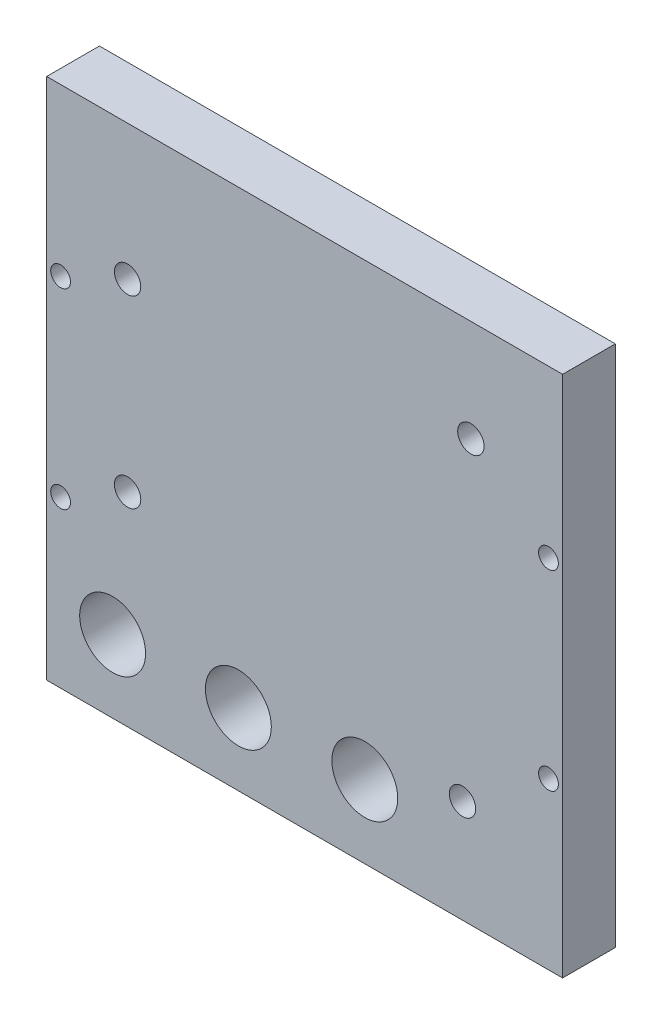
ISO-10303-21;
HEADER;
FILE_DESCRIPTION(('STEP AP214'),'2;1');
FILE_NAME('part.step','',(''),(''),'','','');
FILE_SCHEMA(('AUTOMOTIVE_DESIGN { 1 0 10303 214 1 1 1 1 }'));
ENDSEC;
DATA;
#1=APPLICATION_CONTEXT('core data for automotive mechanical design processes');
#2=APPLICATION_PROTOCOL_DEFINITION('international standard','automotive_design',2000,#1);
#3=PRODUCT_CONTEXT('',#1,'mechanical');
#4=PRODUCT('Part','Part','',(#3));
#5=PRODUCT_RELATED_PRODUCT_CATEGORY('part','',(#4));
#6=PRODUCT_DEFINITION_FORMATION('','',#4);
#7=PRODUCT_DEFINITION_CONTEXT('part definition',#1,'design');
#8=PRODUCT_DEFINITION('design','',#6,#7);
#9=PRODUCT_DEFINITION_SHAPE('','',#8);
#10=(LENGTH_UNIT() NAMED_UNIT(*) SI_UNIT(.MILLI.,.METRE.));
#11=(NAMED_UNIT(*) PLANE_ANGLE_UNIT() SI_UNIT($,.RADIAN.));
#12=(NAMED_UNIT(*) SI_UNIT($,.STERADIAN.) SOLID_ANGLE_UNIT());
#13=UNCERTAINTY_MEASURE_WITH_UNIT(LENGTH_MEASURE(1.E-05),#10,'distance_accuracy_value','');
#14=(GEOMETRIC_REPRESENTATION_CONTEXT(3) GLOBAL_UNCERTAINTY_ASSIGNED_CONTEXT((#13)) GLOBAL_UNIT_ASSIGNED_CONTEXT((#10,
#11,#12)) REPRESENTATION_CONTEXT('',''));
#15=CARTESIAN_POINT('',(0.,0.,0.));
#16=DIRECTION('',(0.,0.,1.));
#17=DIRECTION('',(1.,0.,0.));
#18=AXIS2_PLACEMENT_3D('',#15,#16,#17);
#19=CARTESIAN_POINT('',(0.,0.,8.));
#20=DIRECTION('',(0.,0.,-1.));
#21=DIRECTION('',(-1.,0.,0.));
#22=AXIS2_PLACEMENT_3D('',#19,#20,#21);
#23=PLANE('',#22);
#24=CARTESIAN_POINT('',(37.1622767978347,-14.1859211349172,8.));
#25=DIRECTION('',(0.,0.,1.));
#26=DIRECTION('',(1.,0.,0.));
#27=AXIS2_PLACEMENT_3D('',#24,#25,#26);
#28=CIRCLE('',#27,1.50000000000002);
#29=CARTESIAN_POINT('',(38.6622767978348,-14.1859211349172,8.));
#30=VERTEX_POINT('',#29);
#31=EDGE_CURVE('E163',#30,#30,#28,.T.);
#32=ORIENTED_EDGE('',*,*,#31,.F.);
#33=EDGE_LOOP('',(#32));
#34=FACE_BOUND('',#33,.T.);
#35=CARTESIAN_POINT('',(-36.8377232021654,14.8140788650827,8.));
#36=DIRECTION('',(0.,0.,1.));
#37=DIRECTION('',(1.,0.,0.));
#38=AXIS2_PLACEMENT_3D('',#35,#36,#37);
#39=CIRCLE('',#38,1.49999999999997);
#40=CARTESIAN_POINT('',(-35.3377232021654,14.8140788650827,8.));
#41=VERTEX_POINT('',#40);
#42=EDGE_CURVE('E151',#41,#41,#39,.T.);
#43=ORIENTED_EDGE('',*,*,#42,.F.);
#44=EDGE_LOOP('',(#43));
#45=FACE_BOUND('',#44,.T.);
#46=CARTESIAN_POINT('',(24.1226954878032,-23.6777548777828,8.));
#47=DIRECTION('',(0.,0.,1.));
#48=DIRECTION('',(1.,0.,0.));
#49=AXIS2_PLACEMENT_3D('',#46,#47,#48);
#50=CIRCLE('',#49,2.);
#51=CARTESIAN_POINT('',(26.1226954878032,-23.6777548777828,8.));
#52=VERTEX_POINT('',#51);
#53=EDGE_CURVE('E139',#52,#52,#50,.T.);
#54=ORIENTED_EDGE('',*,*,#53,.F.);
#55=EDGE_LOOP('',(#54));
#56=FACE_BOUND('',#55,.T.);
#57=CARTESIAN_POINT('',(-26.677304512197,19.502245122217,8.));
#58=DIRECTION('',(0.,0.,1.));
#59=DIRECTION('',(1.,0.,0.));
#60=AXIS2_PLACEMENT_3D('',#57,#58,#59);
#61=CIRCLE('',#60,2.);
#62=CARTESIAN_POINT('',(-24.677304512197,19.502245122217,8.));
#63=VERTEX_POINT('',#62);
#64=EDGE_CURVE('E127',#63,#63,#61,.T.);
#65=ORIENTED_EDGE('',*,*,#64,.F.);
#66=EDGE_LOOP('',(#65));
#67=FACE_BOUND('',#66,.T.);
#68=CARTESIAN_POINT('',(9.30112256110283,-28.2174246694478,8.));
#69=DIRECTION('',(0.,0.,1.));
#70=DIRECTION('',(1.,0.,0.));
#71=AXIS2_PLACEMENT_3D('',#68,#69,#70);
#72=CIRCLE('',#71,4.99999999999999);
#73=CARTESIAN_POINT('',(14.3011225611028,-28.2174246694478,8.));
#74=VERTEX_POINT('',#73);
#75=EDGE_CURVE('E115',#74,#74,#72,.T.);
#76=ORIENTED_EDGE('',*,*,#75,.F.);
#77=EDGE_LOOP('',(#76));
#78=FACE_BOUND('',#77,.T.);
#79=DIRECTION('',(1.,0.,0.));
#80=VECTOR('',#79,1.);
#81=CARTESIAN_POINT('',(-38.9488774388858,-39.2977548777828,8.));
#82=LINE('',#81,#80);
#83=CARTESIAN_POINT('',(-38.9488774388858,-39.2977548777828,8.));
#84=VERTEX_POINT('',#83);
#85=CARTESIAN_POINT('',(39.3011225611029,-39.2977548777828,8.));
#86=VERTEX_POINT('',#85);
#87=EDGE_CURVE('E85',#84,#86,#82,.T.);
#88=ORIENTED_EDGE('',*,*,#87,.T.);
#89=DIRECTION('',(0.,1.,0.));
#90=VECTOR('',#89,1.);
#91=CARTESIAN_POINT('',(39.3011225611029,40.0022451222172,8.));
#92=LINE('',#91,#90);
#93=CARTESIAN_POINT('',(39.3011225611029,40.0022451222172,8.));
#94=VERTEX_POINT('',#93);
#95=EDGE_CURVE('E80',#86,#94,#92,.T.);
#96=ORIENTED_EDGE('',*,*,#95,.T.);
#97=DIRECTION('',(-1.,0.,0.));
#98=VECTOR('',#97,1.);
#99=CARTESIAN_POINT('',(-38.9488774388858,40.0022451222172,8.));
#100=LINE('',#99,#98);
#101=CARTESIAN_POINT('',(-38.9488774388858,40.0022451222172,8.));
#102=VERTEX_POINT('',#101);
#103=EDGE_CURVE('E83',#94,#102,#100,.T.);
#104=ORIENTED_EDGE('',*,*,#103,.T.);
#105=DIRECTION('',(0.,-1.,0.));
#106=VECTOR('',#105,1.);
#107=CARTESIAN_POINT('',(-38.9488774388858,40.0022451222172,8.));
#108=LINE('',#107,#106);
#109=EDGE_CURVE('E50',#102,#84,#108,.T.);
#110=ORIENTED_EDGE('',*,*,#109,.T.);
#111=EDGE_LOOP('',(#88,#96,#104,#110));
#112=FACE_BOUND('',#111,.T.);
#113=CARTESIAN_POINT('',(-9.87519483882215,-28.3944124302774,8.));
#114=DIRECTION('',(0.,0.,1.));
#115=DIRECTION('',(1.,0.,0.));
#116=AXIS2_PLACEMENT_3D('',#113,#114,#115);
#117=CIRCLE('',#116,4.99999999999999);
#118=CARTESIAN_POINT('',(-4.87519483882216,-28.3944124302774,8.));
#119=VERTEX_POINT('',#118);
#120=EDGE_CURVE('E100',#119,#119,#117,.T.);
#121=ORIENTED_EDGE('',*,*,#120,.F.);
#122=EDGE_LOOP('',(#121));
#123=FACE_BOUND('',#122,.T.);
#124=CARTESIAN_POINT('',(-28.9488774388857,-28.3036465583011,8.));
#125=DIRECTION('',(0.,0.,1.));
#126=DIRECTION('',(-1.,0.,0.));
#127=AXIS2_PLACEMENT_3D('',#124,#125,#126);
#128=CIRCLE('',#127,4.99999999999999);
#129=CARTESIAN_POINT('',(-33.9488774388857,-28.3036465583011,8.));
#130=VERTEX_POINT('',#129);
#131=EDGE_CURVE('E121',#130,#130,#128,.T.);
#132=ORIENTED_EDGE('',*,*,#131,.F.);
#133=EDGE_LOOP('',(#132));
#134=FACE_BOUND('',#133,.T.);
#135=CARTESIAN_POINT('',(-26.677304512197,-8.43775487778289,8.));
#136=DIRECTION('',(0.,0.,1.));
#137=DIRECTION('',(1.,0.,0.));
#138=AXIS2_PLACEMENT_3D('',#135,#136,#137);
#139=CIRCLE('',#138,2.0000000000001);
#140=CARTESIAN_POINT('',(-24.6773045121969,-8.43775487778289,8.));
#141=VERTEX_POINT('',#140);
#142=EDGE_CURVE('E133',#141,#141,#139,.T.);
#143=ORIENTED_EDGE('',*,*,#142,.F.);
#144=EDGE_LOOP('',(#143));
#145=FACE_BOUND('',#144,.T.);
#146=CARTESIAN_POINT('',(25.392695487803,24.5822451222173,8.));
#147=DIRECTION('',(0.,0.,1.));
#148=DIRECTION('',(1.,0.,0.));
#149=AXIS2_PLACEMENT_3D('',#146,#147,#148);
#150=CIRCLE('',#149,2.);
#151=CARTESIAN_POINT('',(27.392695487803,24.5822451222173,8.));
#152=VERTEX_POINT('',#151);
#153=EDGE_CURVE('E145',#152,#152,#150,.T.);
#154=ORIENTED_EDGE('',*,*,#153,.F.);
#155=EDGE_LOOP('',(#154));
#156=FACE_BOUND('',#155,.T.);
#157=CARTESIAN_POINT('',(-36.8377232021653,-14.1859211349174,8.));
#158=DIRECTION('',(0.,0.,1.));
#159=DIRECTION('',(1.,0.,0.));
#160=AXIS2_PLACEMENT_3D('',#157,#158,#159);
#161=CIRCLE('',#160,1.49999999999997);
#162=CARTESIAN_POINT('',(-35.3377232021653,-14.1859211349174,8.));
#163=VERTEX_POINT('',#162);
#164=EDGE_CURVE('E157',#163,#163,#161,.T.);
#165=ORIENTED_EDGE('',*,*,#164,.F.);
#166=EDGE_LOOP('',(#165));
#167=FACE_BOUND('',#166,.T.);
#168=CARTESIAN_POINT('',(37.1622767978346,14.8140788650829,8.));
#169=DIRECTION('',(0.,0.,1.));
#170=DIRECTION('',(1.,0.,0.));
#171=AXIS2_PLACEMENT_3D('',#168,#169,#170);
#172=CIRCLE('',#171,1.49999999999997);
#173=CARTESIAN_POINT('',(38.6622767978346,14.8140788650829,8.));
#174=VERTEX_POINT('',#173);
#175=EDGE_CURVE('E169',#174,#174,#172,.T.);
#176=ORIENTED_EDGE('',*,*,#175,.F.);
#177=EDGE_LOOP('',(#176));
#178=FACE_BOUND('',#177,.T.);
#179=ADVANCED_FACE('F33',(#34,#45,#56,#67,#78,#112,#123,#134,#145,#156,#167,#178),#23,.F.);
#180=CARTESIAN_POINT('',(0.,0.,0.));
#181=DIRECTION('',(0.,0.,-1.));
#182=DIRECTION('',(-1.,0.,0.));
#183=AXIS2_PLACEMENT_3D('',#180,#181,#182);
#184=PLANE('',#183);
#185=CARTESIAN_POINT('',(37.1622767978347,-14.1859211349172,0.));
#186=DIRECTION('',(0.,0.,1.));
#187=DIRECTION('',(1.,0.,0.));
#188=AXIS2_PLACEMENT_3D('',#185,#186,#187);
#189=CIRCLE('',#188,1.50000000000002);
#190=CARTESIAN_POINT('',(38.6622767978348,-14.1859211349172,0.));
#191=VERTEX_POINT('',#190);
#192=EDGE_CURVE('E166',#191,#191,#189,.T.);
#193=ORIENTED_EDGE('',*,*,#192,.T.);
#194=EDGE_LOOP('',(#193));
#195=FACE_BOUND('',#194,.T.);
#196=CARTESIAN_POINT('',(-36.8377232021654,14.8140788650827,0.));
#197=DIRECTION('',(0.,0.,1.));
#198=DIRECTION('',(1.,0.,0.));
#199=AXIS2_PLACEMENT_3D('',#196,#197,#198);
#200=CIRCLE('',#199,1.49999999999997);
#201=CARTESIAN_POINT('',(-35.3377232021654,14.8140788650827,0.));
#202=VERTEX_POINT('',#201);
#203=EDGE_CURVE('E154',#202,#202,#200,.T.);
#204=ORIENTED_EDGE('',*,*,#203,.T.);
#205=EDGE_LOOP('',(#204));
#206=FACE_BOUND('',#205,.T.);
#207=CARTESIAN_POINT('',(24.1226954878032,-23.6777548777828,0.));
#208=DIRECTION('',(0.,0.,1.));
#209=DIRECTION('',(1.,0.,0.));
#210=AXIS2_PLACEMENT_3D('',#207,#208,#209);
#211=CIRCLE('',#210,2.);
#212=CARTESIAN_POINT('',(26.1226954878032,-23.6777548777828,0.));
#213=VERTEX_POINT('',#212);
#214=EDGE_CURVE('E142',#213,#213,#211,.T.);
#215=ORIENTED_EDGE('',*,*,#214,.T.);
#216=EDGE_LOOP('',(#215));
#217=FACE_BOUND('',#216,.T.);
#218=CARTESIAN_POINT('',(-26.677304512197,19.502245122217,0.));
#219=DIRECTION('',(0.,0.,1.));
#220=DIRECTION('',(1.,0.,0.));
#221=AXIS2_PLACEMENT_3D('',#218,#219,#220);
#222=CIRCLE('',#221,2.);
#223=CARTESIAN_POINT('',(-24.677304512197,19.502245122217,0.));
#224=VERTEX_POINT('',#223);
#225=EDGE_CURVE('E130',#224,#224,#222,.T.);
#226=ORIENTED_EDGE('',*,*,#225,.T.);
#227=EDGE_LOOP('',(#226));
#228=FACE_BOUND('',#227,.T.);
#229=CARTESIAN_POINT('',(9.30112256110283,-28.2174246694478,0.));
#230=DIRECTION('',(0.,0.,1.));
#231=DIRECTION('',(1.,0.,0.));
#232=AXIS2_PLACEMENT_3D('',#229,#230,#231);
#233=CIRCLE('',#232,4.99999999999999);
#234=CARTESIAN_POINT('',(14.3011225611028,-28.2174246694478,0.));
#235=VERTEX_POINT('',#234);
#236=EDGE_CURVE('E118',#235,#235,#233,.T.);
#237=ORIENTED_EDGE('',*,*,#236,.T.);
#238=EDGE_LOOP('',(#237));
#239=FACE_BOUND('',#238,.T.);
#240=DIRECTION('',(1.,0.,0.));
#241=VECTOR('',#240,1.);
#242=CARTESIAN_POINT('',(-38.9488774388858,-39.2977548777828,0.));
#243=LINE('',#242,#241);
#244=CARTESIAN_POINT('',(-38.9488774388858,-39.2977548777828,0.));
#245=VERTEX_POINT('',#244);
#246=CARTESIAN_POINT('',(39.3011225611029,-39.2977548777828,0.));
#247=VERTEX_POINT('',#246);
#248=EDGE_CURVE('E97',#245,#247,#243,.T.);
#249=ORIENTED_EDGE('',*,*,#248,.F.);
#250=DIRECTION('',(0.,-1.,0.));
#251=VECTOR('',#250,1.);
#252=CARTESIAN_POINT('',(-38.9488774388858,40.0022451222172,0.));
#253=LINE('',#252,#251);
#254=CARTESIAN_POINT('',(-38.9488774388858,40.0022451222172,0.));
#255=VERTEX_POINT('',#254);
#256=EDGE_CURVE('E73',#255,#245,#253,.T.);
#257=ORIENTED_EDGE('',*,*,#256,.F.);
#258=DIRECTION('',(-1.,0.,0.));
#259=VECTOR('',#258,1.);
#260=CARTESIAN_POINT('',(-38.9488774388858,40.0022451222172,0.));
#261=LINE('',#260,#259);
#262=CARTESIAN_POINT('',(39.3011225611029,40.0022451222172,0.));
#263=VERTEX_POINT('',#262);
#264=EDGE_CURVE('E67',#263,#255,#261,.T.);
#265=ORIENTED_EDGE('',*,*,#264,.F.);
#266=DIRECTION('',(0.,1.,0.));
#267=VECTOR('',#266,1.);
#268=CARTESIAN_POINT('',(39.3011225611029,40.0022451222172,0.));
#269=LINE('',#268,#267);
#270=EDGE_CURVE('E89',#247,#263,#269,.T.);
#271=ORIENTED_EDGE('',*,*,#270,.F.);
#272=EDGE_LOOP('',(#249,#257,#265,#271));
#273=FACE_BOUND('',#272,.T.);
#274=CARTESIAN_POINT('',(-9.87519483882215,-28.3944124302774,0.));
#275=DIRECTION('',(0.,0.,1.));
#276=DIRECTION('',(1.,0.,0.));
#277=AXIS2_PLACEMENT_3D('',#274,#275,#276);
#278=CIRCLE('',#277,4.99999999999999);
#279=CARTESIAN_POINT('',(-4.87519483882216,-28.3944124302774,0.));
#280=VERTEX_POINT('',#279);
#281=EDGE_CURVE('E112',#280,#280,#278,.T.);
#282=ORIENTED_EDGE('',*,*,#281,.T.);
#283=EDGE_LOOP('',(#282));
#284=FACE_BOUND('',#283,.T.);
#285=CARTESIAN_POINT('',(-28.9488774388857,-28.3036465583011,0.));
#286=DIRECTION('',(0.,0.,1.));
#287=DIRECTION('',(-1.,0.,0.));
#288=AXIS2_PLACEMENT_3D('',#285,#286,#287);
#289=CIRCLE('',#288,4.99999999999999);
#290=CARTESIAN_POINT('',(-33.9488774388857,-28.3036465583011,0.));
#291=VERTEX_POINT('',#290);
#292=EDGE_CURVE('E124',#291,#291,#289,.T.);
#293=ORIENTED_EDGE('',*,*,#292,.T.);
#294=EDGE_LOOP('',(#293));
#295=FACE_BOUND('',#294,.T.);
#296=CARTESIAN_POINT('',(-26.677304512197,-8.43775487778289,0.));
#297=DIRECTION('',(0.,0.,1.));
#298=DIRECTION('',(1.,0.,0.));
#299=AXIS2_PLACEMENT_3D('',#296,#297,#298);
#300=CIRCLE('',#299,2.0000000000001);
#301=CARTESIAN_POINT('',(-24.6773045121969,-8.43775487778289,0.));
#302=VERTEX_POINT('',#301);
#303=EDGE_CURVE('E136',#302,#302,#300,.T.);
#304=ORIENTED_EDGE('',*,*,#303,.T.);
#305=EDGE_LOOP('',(#304));
#306=FACE_BOUND('',#305,.T.);
#307=CARTESIAN_POINT('',(25.392695487803,24.5822451222173,0.));
#308=DIRECTION('',(0.,0.,1.));
#309=DIRECTION('',(1.,0.,0.));
#310=AXIS2_PLACEMENT_3D('',#307,#308,#309);
#311=CIRCLE('',#310,2.);
#312=CARTESIAN_POINT('',(27.392695487803,24.5822451222173,0.));
#313=VERTEX_POINT('',#312);
#314=EDGE_CURVE('E148',#313,#313,#311,.T.);
#315=ORIENTED_EDGE('',*,*,#314,.T.);
#316=EDGE_LOOP('',(#315));
#317=FACE_BOUND('',#316,.T.);
#318=CARTESIAN_POINT('',(-36.8377232021653,-14.1859211349174,0.));
#319=DIRECTION('',(0.,0.,1.));
#320=DIRECTION('',(1.,0.,0.));
#321=AXIS2_PLACEMENT_3D('',#318,#319,#320);
#322=CIRCLE('',#321,1.49999999999997);
#323=CARTESIAN_POINT('',(-35.3377232021653,-14.1859211349174,0.));
#324=VERTEX_POINT('',#323);
#325=EDGE_CURVE('E160',#324,#324,#322,.T.);
#326=ORIENTED_EDGE('',*,*,#325,.T.);
#327=EDGE_LOOP('',(#326));
#328=FACE_BOUND('',#327,.T.);
#329=CARTESIAN_POINT('',(37.1622767978346,14.8140788650829,0.));
#330=DIRECTION('',(0.,0.,1.));
#331=DIRECTION('',(1.,0.,0.));
#332=AXIS2_PLACEMENT_3D('',#329,#330,#331);
#333=CIRCLE('',#332,1.49999999999997);
#334=CARTESIAN_POINT('',(38.6622767978346,14.8140788650829,0.));
#335=VERTEX_POINT('',#334);
#336=EDGE_CURVE('E172',#335,#335,#333,.T.);
#337=ORIENTED_EDGE('',*,*,#336,.T.);
#338=EDGE_LOOP('',(#337));
#339=FACE_BOUND('',#338,.T.);
#340=ADVANCED_FACE('F108',(#195,#206,#217,#228,#239,#273,#284,#295,#306,#317,#328,#339),#184,.T.);
#341=CARTESIAN_POINT('',(-38.9488774388858,-39.2977548777828,8.));
#342=DIRECTION('',(0.,1.,0.));
#343=DIRECTION('',(0.,0.,1.));
#344=AXIS2_PLACEMENT_3D('',#341,#342,#343);
#345=PLANE('',#344);
#346=ORIENTED_EDGE('',*,*,#248,.T.);
#347=DIRECTION('',(0.,0.,-1.));
#348=VECTOR('',#347,1.);
#349=CARTESIAN_POINT('',(39.3011225611029,-39.2977548777828,8.));
#350=LINE('',#349,#348);
#351=EDGE_CURVE('E11',#86,#247,#350,.T.);
#352=ORIENTED_EDGE('',*,*,#351,.F.);
#353=ORIENTED_EDGE('',*,*,#87,.F.);
#354=DIRECTION('',(0.,0.,-1.));
#355=VECTOR('',#354,1.);
#356=CARTESIAN_POINT('',(-38.9488774388858,-39.2977548777828,8.));
#357=LINE('',#356,#355);
#358=EDGE_CURVE('E93',#84,#245,#357,.T.);
#359=ORIENTED_EDGE('',*,*,#358,.T.);
#360=EDGE_LOOP('',(#346,#352,#353,#359));
#361=FACE_BOUND('',#360,.T.);
#362=ADVANCED_FACE('F35',(#361),#345,.F.);
#363=CARTESIAN_POINT('',(39.3011225611029,40.0022451222172,8.));
#364=DIRECTION('',(-1.,0.,0.));
#365=DIRECTION('',(0.,0.,1.));
#366=AXIS2_PLACEMENT_3D('',#363,#364,#365);
#367=PLANE('',#366);
#368=ORIENTED_EDGE('',*,*,#270,.T.);
#369=DIRECTION('',(0.,0.,-1.));
#370=VECTOR('',#369,1.);
#371=CARTESIAN_POINT('',(39.3011225611029,40.0022451222172,8.));
#372=LINE('',#371,#370);
#373=EDGE_CURVE('E42',#94,#263,#372,.T.);
#374=ORIENTED_EDGE('',*,*,#373,.F.);
#375=ORIENTED_EDGE('',*,*,#95,.F.);
#376=ORIENTED_EDGE('',*,*,#351,.T.);
#377=EDGE_LOOP('',(#368,#374,#375,#376));
#378=FACE_BOUND('',#377,.T.);
#379=ADVANCED_FACE('F88',(#378),#367,.F.);
#380=CARTESIAN_POINT('',(-38.9488774388858,40.0022451222172,8.));
#381=DIRECTION('',(0.,-1.,0.));
#382=DIRECTION('',(0.,0.,-1.));
#383=AXIS2_PLACEMENT_3D('',#380,#381,#382);
#384=PLANE('',#383);
#385=ORIENTED_EDGE('',*,*,#264,.T.);
#386=DIRECTION('',(0.,0.,-1.));
#387=VECTOR('',#386,1.);
#388=CARTESIAN_POINT('',(-38.9488774388858,40.0022451222172,8.));
#389=LINE('',#388,#387);
#390=EDGE_CURVE('E90',#102,#255,#389,.T.);
#391=ORIENTED_EDGE('',*,*,#390,.F.);
#392=ORIENTED_EDGE('',*,*,#103,.F.);
#393=ORIENTED_EDGE('',*,*,#373,.T.);
#394=EDGE_LOOP('',(#385,#391,#392,#393));
#395=FACE_BOUND('',#394,.T.);
#396=ADVANCED_FACE('F91',(#395),#384,.F.);
#397=CARTESIAN_POINT('',(-38.9488774388858,40.0022451222172,8.));
#398=DIRECTION('',(1.,0.,0.));
#399=DIRECTION('',(0.,0.,-1.));
#400=AXIS2_PLACEMENT_3D('',#397,#398,#399);
#401=PLANE('',#400);
#402=ORIENTED_EDGE('',*,*,#256,.T.);
#403=ORIENTED_EDGE('',*,*,#358,.F.);
#404=ORIENTED_EDGE('',*,*,#109,.F.);
#405=ORIENTED_EDGE('',*,*,#390,.T.);
#406=EDGE_LOOP('',(#402,#403,#404,#405));
#407=FACE_BOUND('',#406,.T.);
#408=ADVANCED_FACE('F105',(#407),#401,.F.);
#409=CARTESIAN_POINT('',(-9.87519483882215,-28.3944124302774,8.));
#410=DIRECTION('',(0.,0.,-1.));
#411=DIRECTION('',(-1.,0.,0.));
#412=AXIS2_PLACEMENT_3D('',#409,#410,#411);
#413=CYLINDRICAL_SURFACE('',#412,4.99999999999999);
#414=ORIENTED_EDGE('',*,*,#120,.T.);
#415=EDGE_LOOP('',(#414));
#416=FACE_BOUND('',#415,.T.);
#417=ORIENTED_EDGE('',*,*,#281,.F.);
#418=EDGE_LOOP('',(#417));
#419=FACE_BOUND('',#418,.T.);
#420=ADVANCED_FACE('F192',(#416,#419),#413,.F.);
#421=CARTESIAN_POINT('',(9.30112256110283,-28.2174246694478,8.));
#422=DIRECTION('',(0.,0.,-1.));
#423=DIRECTION('',(-1.,0.,0.));
#424=AXIS2_PLACEMENT_3D('',#421,#422,#423);
#425=CYLINDRICAL_SURFACE('',#424,4.99999999999999);
#426=ORIENTED_EDGE('',*,*,#75,.T.);
#427=EDGE_LOOP('',(#426));
#428=FACE_BOUND('',#427,.T.);
#429=ORIENTED_EDGE('',*,*,#236,.F.);
#430=EDGE_LOOP('',(#429));
#431=FACE_BOUND('',#430,.T.);
#432=ADVANCED_FACE('F238',(#428,#431),#425,.F.);
#433=CARTESIAN_POINT('',(-28.9488774388857,-28.3036465583011,8.));
#434=DIRECTION('',(0.,0.,-1.));
#435=DIRECTION('',(-1.,0.,0.));
#436=AXIS2_PLACEMENT_3D('',#433,#434,#435);
#437=CYLINDRICAL_SURFACE('',#436,4.99999999999999);
#438=ORIENTED_EDGE('',*,*,#131,.T.);
#439=EDGE_LOOP('',(#438));
#440=FACE_BOUND('',#439,.T.);
#441=ORIENTED_EDGE('',*,*,#292,.F.);
#442=EDGE_LOOP('',(#441));
#443=FACE_BOUND('',#442,.T.);
#444=ADVANCED_FACE('F246',(#440,#443),#437,.F.);
#445=CARTESIAN_POINT('',(-26.677304512197,19.502245122217,8.));
#446=DIRECTION('',(0.,0.,-1.));
#447=DIRECTION('',(-1.,0.,0.));
#448=AXIS2_PLACEMENT_3D('',#445,#446,#447);
#449=CYLINDRICAL_SURFACE('',#448,2.);
#450=ORIENTED_EDGE('',*,*,#64,.T.);
#451=EDGE_LOOP('',(#450));
#452=FACE_BOUND('',#451,.T.);
#453=ORIENTED_EDGE('',*,*,#225,.F.);
#454=EDGE_LOOP('',(#453));
#455=FACE_BOUND('',#454,.T.);
#456=ADVANCED_FACE('F254',(#452,#455),#449,.F.);
#457=CARTESIAN_POINT('',(-26.677304512197,-8.43775487778289,8.));
#458=DIRECTION('',(0.,0.,-1.));
#459=DIRECTION('',(-1.,0.,0.));
#460=AXIS2_PLACEMENT_3D('',#457,#458,#459);
#461=CYLINDRICAL_SURFACE('',#460,2.0000000000001);
#462=ORIENTED_EDGE('',*,*,#142,.T.);
#463=EDGE_LOOP('',(#462));
#464=FACE_BOUND('',#463,.T.);
#465=ORIENTED_EDGE('',*,*,#303,.F.);
#466=EDGE_LOOP('',(#465));
#467=FACE_BOUND('',#466,.T.);
#468=ADVANCED_FACE('F263',(#464,#467),#461,.F.);
#469=CARTESIAN_POINT('',(24.1226954878032,-23.6777548777828,8.));
#470=DIRECTION('',(0.,0.,-1.));
#471=DIRECTION('',(-1.,0.,0.));
#472=AXIS2_PLACEMENT_3D('',#469,#470,#471);
#473=CYLINDRICAL_SURFACE('',#472,2.);
#474=ORIENTED_EDGE('',*,*,#53,.T.);
#475=EDGE_LOOP('',(#474));
#476=FACE_BOUND('',#475,.T.);
#477=ORIENTED_EDGE('',*,*,#214,.F.);
#478=EDGE_LOOP('',(#477));
#479=FACE_BOUND('',#478,.T.);
#480=ADVANCED_FACE('F272',(#476,#479),#473,.F.);
#481=CARTESIAN_POINT('',(25.392695487803,24.5822451222173,8.));
#482=DIRECTION('',(0.,0.,-1.));
#483=DIRECTION('',(-1.,0.,0.));
#484=AXIS2_PLACEMENT_3D('',#481,#482,#483);
#485=CYLINDRICAL_SURFACE('',#484,2.);
#486=ORIENTED_EDGE('',*,*,#153,.T.);
#487=EDGE_LOOP('',(#486));
#488=FACE_BOUND('',#487,.T.);
#489=ORIENTED_EDGE('',*,*,#314,.F.);
#490=EDGE_LOOP('',(#489));
#491=FACE_BOUND('',#490,.T.);
#492=ADVANCED_FACE('F281',(#488,#491),#485,.F.);
#493=CARTESIAN_POINT('',(-36.8377232021654,14.8140788650827,8.));
#494=DIRECTION('',(0.,0.,-1.));
#495=DIRECTION('',(-1.,0.,0.));
#496=AXIS2_PLACEMENT_3D('',#493,#494,#495);
#497=CYLINDRICAL_SURFACE('',#496,1.49999999999997);
#498=ORIENTED_EDGE('',*,*,#42,.T.);
#499=EDGE_LOOP('',(#498));
#500=FACE_BOUND('',#499,.T.);
#501=ORIENTED_EDGE('',*,*,#203,.F.);
#502=EDGE_LOOP('',(#501));
#503=FACE_BOUND('',#502,.T.);
#504=ADVANCED_FACE('F290',(#500,#503),#497,.F.);
#505=CARTESIAN_POINT('',(-36.8377232021653,-14.1859211349174,8.));
#506=DIRECTION('',(0.,0.,-1.));
#507=DIRECTION('',(-1.,0.,0.));
#508=AXIS2_PLACEMENT_3D('',#505,#506,#507);
#509=CYLINDRICAL_SURFACE('',#508,1.49999999999997);
#510=ORIENTED_EDGE('',*,*,#164,.T.);
#511=EDGE_LOOP('',(#510));
#512=FACE_BOUND('',#511,.T.);
#513=ORIENTED_EDGE('',*,*,#325,.F.);
#514=EDGE_LOOP('',(#513));
#515=FACE_BOUND('',#514,.T.);
#516=ADVANCED_FACE('F299',(#512,#515),#509,.F.);
#517=CARTESIAN_POINT('',(37.1622767978347,-14.1859211349172,8.));
#518=DIRECTION('',(0.,0.,-1.));
#519=DIRECTION('',(-1.,0.,0.));
#520=AXIS2_PLACEMENT_3D('',#517,#518,#519);
#521=CYLINDRICAL_SURFACE('',#520,1.50000000000002);
#522=ORIENTED_EDGE('',*,*,#31,.T.);
#523=EDGE_LOOP('',(#522));
#524=FACE_BOUND('',#523,.T.);
#525=ORIENTED_EDGE('',*,*,#192,.F.);
#526=EDGE_LOOP('',(#525));
#527=FACE_BOUND('',#526,.T.);
#528=ADVANCED_FACE('F308',(#524,#527),#521,.F.);
#529=CARTESIAN_POINT('',(37.1622767978346,14.8140788650829,8.));
#530=DIRECTION('',(0.,0.,-1.));
#531=DIRECTION('',(-1.,0.,0.));
#532=AXIS2_PLACEMENT_3D('',#529,#530,#531);
#533=CYLINDRICAL_SURFACE('',#532,1.49999999999997);
#534=ORIENTED_EDGE('',*,*,#175,.T.);
#535=EDGE_LOOP('',(#534));
#536=FACE_BOUND('',#535,.T.);
#537=ORIENTED_EDGE('',*,*,#336,.F.);
#538=EDGE_LOOP('',(#537));
#539=FACE_BOUND('',#538,.T.);
#540=ADVANCED_FACE('F178',(#536,#539),#533,.F.);
#541=CLOSED_SHELL('',(#179,#340,#362,#379,#396,#408,#420,#432,#444,#456,#468,#480,#492,#504,
#516,#528,#540));
#542=MANIFOLD_SOLID_BREP('B2',#541);
#543=ADVANCED_BREP_SHAPE_REPRESENTATION('',(#18,#542),#14);
#544=SHAPE_DEFINITION_REPRESENTATION(#9,#543);
ENDSEC;
END-ISO-10303-21;
